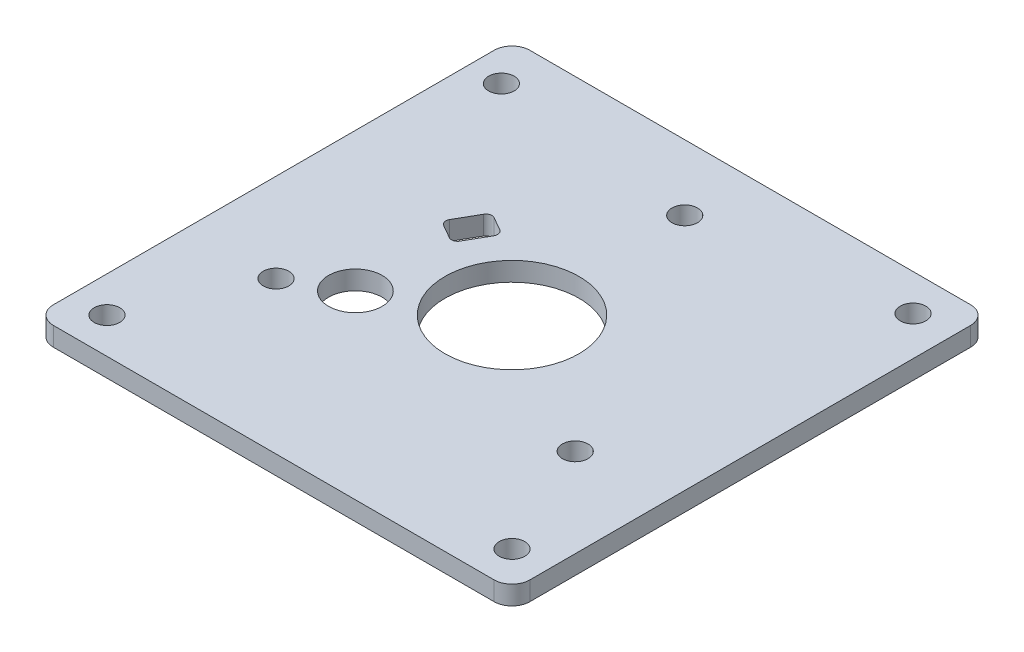
ISO-10303-21;
HEADER;
FILE_DESCRIPTION(('STEP AP214'),'2;1');
FILE_NAME('part.step','',(''),(''),'','','');
FILE_SCHEMA(('AUTOMOTIVE_DESIGN { 1 0 10303 214 1 1 1 1 }'));
ENDSEC;
DATA;
#1=APPLICATION_CONTEXT('core data for automotive mechanical design processes');
#2=APPLICATION_PROTOCOL_DEFINITION('international standard','automotive_design',2000,#1);
#3=PRODUCT_CONTEXT('',#1,'mechanical');
#4=PRODUCT('Part','Part','',(#3));
#5=PRODUCT_RELATED_PRODUCT_CATEGORY('part','',(#4));
#6=PRODUCT_DEFINITION_FORMATION('','',#4);
#7=PRODUCT_DEFINITION_CONTEXT('part definition',#1,'design');
#8=PRODUCT_DEFINITION('design','',#6,#7);
#9=PRODUCT_DEFINITION_SHAPE('','',#8);
#10=(LENGTH_UNIT() NAMED_UNIT(*) SI_UNIT(.MILLI.,.METRE.));
#11=(NAMED_UNIT(*) PLANE_ANGLE_UNIT() SI_UNIT($,.RADIAN.));
#12=(NAMED_UNIT(*) SI_UNIT($,.STERADIAN.) SOLID_ANGLE_UNIT());
#13=UNCERTAINTY_MEASURE_WITH_UNIT(LENGTH_MEASURE(1.E-05),#10,'distance_accuracy_value','');
#14=(GEOMETRIC_REPRESENTATION_CONTEXT(3) GLOBAL_UNCERTAINTY_ASSIGNED_CONTEXT((#13)) GLOBAL_UNIT_ASSIGNED_CONTEXT((#10,
#11,#12)) REPRESENTATION_CONTEXT('',''));
#15=CARTESIAN_POINT('',(0.,0.,0.));
#16=DIRECTION('',(0.,0.,1.));
#17=DIRECTION('',(1.,0.,0.));
#18=AXIS2_PLACEMENT_3D('',#15,#16,#17);
#19=CARTESIAN_POINT('',(0.,3.175,0.));
#20=DIRECTION('',(0.,-1.,0.));
#21=DIRECTION('',(0.,0.,-1.));
#22=AXIS2_PLACEMENT_3D('',#19,#20,#21);
#23=PLANE('',#22);
#24=CARTESIAN_POINT('',(-16.6709890228504,3.175,9.625));
#25=DIRECTION('',(0.,1.,0.));
#26=DIRECTION('',(0.,0.,1.));
#27=AXIS2_PLACEMENT_3D('',#24,#25,#26);
#28=CIRCLE('',#27,4.5);
#29=CARTESIAN_POINT('',(-16.6709890228504,3.175,14.125));
#30=VERTEX_POINT('',#29);
#31=EDGE_CURVE('E313',#30,#30,#28,.T.);
#32=ORIENTED_EDGE('',*,*,#31,.F.);
#33=EDGE_LOOP('',(#32));
#34=FACE_BOUND('',#33,.T.);
#35=CARTESIAN_POINT('',(-34.552045292833,3.175,-32.7718254397796));
#36=DIRECTION('',(0.,1.,0.));
#37=DIRECTION('',(0.,0.,-1.));
#38=AXIS2_PLACEMENT_3D('',#35,#36,#37);
#39=CIRCLE('',#38,2.15);
#40=CARTESIAN_POINT('',(-34.552045292833,3.175,-34.9218254397796));
#41=VERTEX_POINT('',#40);
#42=EDGE_CURVE('E333',#41,#41,#39,.T.);
#43=ORIENTED_EDGE('',*,*,#42,.F.);
#44=EDGE_LOOP('',(#43));
#45=FACE_BOUND('',#44,.T.);
#46=CARTESIAN_POINT('',(33.4386592201806,3.175,-33.8961473794748));
#47=DIRECTION('',(0.,1.,0.));
#48=DIRECTION('',(0.,0.,1.));
#49=AXIS2_PLACEMENT_3D('',#46,#47,#48);
#50=CIRCLE('',#49,2.15000000000001);
#51=CARTESIAN_POINT('',(33.4386592201806,3.175,-31.7461473794748));
#52=VERTEX_POINT('',#51);
#53=EDGE_CURVE('E341',#52,#52,#50,.T.);
#54=ORIENTED_EDGE('',*,*,#53,.F.);
#55=EDGE_LOOP('',(#54));
#56=FACE_BOUND('',#55,.T.);
#57=CARTESIAN_POINT('',(34.,3.175,34.));
#58=DIRECTION('',(0.,1.,0.));
#59=DIRECTION('',(0.,0.,-1.));
#60=AXIS2_PLACEMENT_3D('',#57,#58,#59);
#61=CIRCLE('',#60,2.15);
#62=CARTESIAN_POINT('',(34.,3.175,31.85));
#63=VERTEX_POINT('',#62);
#64=EDGE_CURVE('E349',#63,#63,#61,.T.);
#65=ORIENTED_EDGE('',*,*,#64,.F.);
#66=EDGE_LOOP('',(#65));
#67=FACE_BOUND('',#66,.T.);
#68=CARTESIAN_POINT('',(-25.1147367097478,3.175,14.4999999999995));
#69=DIRECTION('',(0.,1.,0.));
#70=DIRECTION('',(0.,0.,1.));
#71=AXIS2_PLACEMENT_3D('',#68,#69,#70);
#72=CIRCLE('',#71,2.15000000000057);
#73=CARTESIAN_POINT('',(-25.1147367097478,3.175,16.65));
#74=VERTEX_POINT('',#73);
#75=EDGE_CURVE('E357',#74,#74,#72,.T.);
#76=ORIENTED_EDGE('',*,*,#75,.F.);
#77=EDGE_LOOP('',(#76));
#78=FACE_BOUND('',#77,.T.);
#79=CARTESIAN_POINT('',(25.1147367097487,3.175,14.4999999999989));
#80=DIRECTION('',(0.,1.,0.));
#81=DIRECTION('',(0.,0.,1.));
#82=AXIS2_PLACEMENT_3D('',#79,#80,#81);
#83=CIRCLE('',#82,2.15000000000118);
#84=CARTESIAN_POINT('',(25.1147367097487,3.175,16.6500000000001));
#85=VERTEX_POINT('',#84);
#86=EDGE_CURVE('E365',#85,#85,#83,.T.);
#87=ORIENTED_EDGE('',*,*,#86,.F.);
#88=EDGE_LOOP('',(#87));
#89=FACE_BOUND('',#88,.T.);
#90=CARTESIAN_POINT('',(-34.,3.175,34.));
#91=DIRECTION('',(0.,1.,0.));
#92=DIRECTION('',(0.,0.,1.));
#93=AXIS2_PLACEMENT_3D('',#90,#91,#92);
#94=CIRCLE('',#93,2.15);
#95=CARTESIAN_POINT('',(-34.,3.175,36.15));
#96=VERTEX_POINT('',#95);
#97=EDGE_CURVE('E373',#96,#96,#94,.T.);
#98=ORIENTED_EDGE('',*,*,#97,.F.);
#99=EDGE_LOOP('',(#98));
#100=FACE_BOUND('',#99,.T.);
#101=CARTESIAN_POINT('',(0.,3.175,-29.));
#102=DIRECTION('',(0.,1.,0.));
#103=DIRECTION('',(0.,0.,1.));
#104=AXIS2_PLACEMENT_3D('',#101,#102,#103);
#105=CIRCLE('',#104,2.15);
#106=CARTESIAN_POINT('',(0.,3.175,-26.85));
#107=VERTEX_POINT('',#106);
#108=EDGE_CURVE('E381',#107,#107,#105,.T.);
#109=ORIENTED_EDGE('',*,*,#108,.F.);
#110=EDGE_LOOP('',(#109));
#111=FACE_BOUND('',#110,.T.);
#112=CARTESIAN_POINT('',(0.,3.175,0.));
#113=DIRECTION('',(0.,1.,0.));
#114=DIRECTION('',(0.,0.,1.));
#115=AXIS2_PLACEMENT_3D('',#112,#113,#114);
#116=CIRCLE('',#115,11.25);
#117=CARTESIAN_POINT('',(0.,3.175,11.25));
#118=VERTEX_POINT('',#117);
#119=EDGE_CURVE('E389',#118,#118,#116,.T.);
#120=ORIENTED_EDGE('',*,*,#119,.F.);
#121=EDGE_LOOP('',(#120));
#122=FACE_BOUND('',#121,.T.);
#123=DIRECTION('',(0.,0.,1.));
#124=VECTOR('',#123,1.);
#125=CARTESIAN_POINT('',(-40.,3.175,40.));
#126=LINE('',#125,#124);
#127=CARTESIAN_POINT('',(-40.,3.175,-37.));
#128=VERTEX_POINT('',#127);
#129=CARTESIAN_POINT('',(-40.,3.175,37.));
#130=VERTEX_POINT('',#129);
#131=EDGE_CURVE('E400',#128,#130,#126,.T.);
#132=ORIENTED_EDGE('',*,*,#131,.T.);
#133=CARTESIAN_POINT('',(-37.,3.175,37.));
#134=DIRECTION('',(0.,-1.,0.));
#135=DIRECTION('',(0.,0.,-1.));
#136=AXIS2_PLACEMENT_3D('',#133,#134,#135);
#137=CIRCLE('',#136,3.);
#138=CARTESIAN_POINT('',(-37.,3.175,40.));
#139=VERTEX_POINT('',#138);
#140=EDGE_CURVE('E224',#130,#139,#137,.F.);
#141=ORIENTED_EDGE('',*,*,#140,.T.);
#142=DIRECTION('',(1.,0.,0.));
#143=VECTOR('',#142,1.);
#144=CARTESIAN_POINT('',(-40.,3.175,40.));
#145=LINE('',#144,#143);
#146=CARTESIAN_POINT('',(37.,3.175,40.));
#147=VERTEX_POINT('',#146);
#148=EDGE_CURVE('E180',#139,#147,#145,.T.);
#149=ORIENTED_EDGE('',*,*,#148,.T.);
#150=CARTESIAN_POINT('',(37.,3.175,37.));
#151=DIRECTION('',(0.,-1.,0.));
#152=DIRECTION('',(0.,0.,-1.));
#153=AXIS2_PLACEMENT_3D('',#150,#151,#152);
#154=CIRCLE('',#153,3.);
#155=CARTESIAN_POINT('',(40.,3.175,37.));
#156=VERTEX_POINT('',#155);
#157=EDGE_CURVE('E221',#147,#156,#154,.F.);
#158=ORIENTED_EDGE('',*,*,#157,.T.);
#159=DIRECTION('',(0.,0.,-1.));
#160=VECTOR('',#159,1.);
#161=CARTESIAN_POINT('',(40.,3.175,40.));
#162=LINE('',#161,#160);
#163=CARTESIAN_POINT('',(40.,3.175,-37.));
#164=VERTEX_POINT('',#163);
#165=EDGE_CURVE('E189',#156,#164,#162,.T.);
#166=ORIENTED_EDGE('',*,*,#165,.T.);
#167=CARTESIAN_POINT('',(37.,3.175,-37.));
#168=DIRECTION('',(0.,-1.,0.));
#169=DIRECTION('',(0.,0.,-1.));
#170=AXIS2_PLACEMENT_3D('',#167,#168,#169);
#171=CIRCLE('',#170,3.);
#172=CARTESIAN_POINT('',(37.,3.175,-40.));
#173=VERTEX_POINT('',#172);
#174=EDGE_CURVE('E218',#164,#173,#171,.F.);
#175=ORIENTED_EDGE('',*,*,#174,.T.);
#176=DIRECTION('',(-1.,0.,0.));
#177=VECTOR('',#176,1.);
#178=CARTESIAN_POINT('',(-40.,3.175,-40.));
#179=LINE('',#178,#177);
#180=CARTESIAN_POINT('',(-37.,3.175,-40.));
#181=VERTEX_POINT('',#180);
#182=EDGE_CURVE('E195',#173,#181,#179,.T.);
#183=ORIENTED_EDGE('',*,*,#182,.T.);
#184=CARTESIAN_POINT('',(-37.,3.175,-37.));
#185=DIRECTION('',(0.,-1.,0.));
#186=DIRECTION('',(0.,0.,-1.));
#187=AXIS2_PLACEMENT_3D('',#184,#185,#186);
#188=CIRCLE('',#187,3.);
#189=EDGE_CURVE('E215',#181,#128,#188,.F.);
#190=ORIENTED_EDGE('',*,*,#189,.T.);
#191=EDGE_LOOP('',(#132,#141,#149,#158,#166,#175,#183,#190));
#192=FACE_BOUND('',#191,.T.);
#193=DIRECTION('',(-0.497198669268816,0.,0.867636723103234));
#194=VECTOR('',#193,1.);
#195=CARTESIAN_POINT('',(-16.5436071877628,3.175,-13.1611878160145));
#196=LINE('',#195,#194);
#197=CARTESIAN_POINT('',(-17.0408058570316,3.175,-12.2935510929113));
#198=VERTEX_POINT('',#197);
#199=CARTESIAN_POINT('',(-19.1290402679607,3.175,-8.64947685587768));
#200=VERTEX_POINT('',#199);
#201=EDGE_CURVE('E328',#198,#200,#196,.T.);
#202=ORIENTED_EDGE('',*,*,#201,.F.);
#203=CARTESIAN_POINT('',(-16.1731691339284,3.175,-11.7963524236425));
#204=DIRECTION('',(0.,-1.,0.));
#205=DIRECTION('',(0.,0.,-1.));
#206=AXIS2_PLACEMENT_3D('',#203,#204,#205);
#207=CIRCLE('',#206,1.);
#208=CARTESIAN_POINT('',(-15.6759704646596,3.175,-12.6639891467457));
#209=VERTEX_POINT('',#208);
#210=EDGE_CURVE('E11',#198,#209,#207,.T.);
#211=ORIENTED_EDGE('',*,*,#210,.T.);
#212=DIRECTION('',(-0.867636723103236,0.,-0.497198669268813));
#213=VECTOR('',#212,1.);
#214=CARTESIAN_POINT('',(-12.5524782614879,3.175,-10.874073937378));
#215=LINE('',#214,#213);
#216=CARTESIAN_POINT('',(-13.4201149845912,3.175,-11.3712726066468));
#217=VERTEX_POINT('',#216);
#218=EDGE_CURVE('E304',#217,#209,#215,.T.);
#219=ORIENTED_EDGE('',*,*,#218,.F.);
#220=CARTESIAN_POINT('',(-13.91731365386,3.175,-10.5036358835435));
#221=DIRECTION('',(0.,-1.,0.));
#222=DIRECTION('',(0.,0.,-1.));
#223=AXIS2_PLACEMENT_3D('',#220,#221,#222);
#224=CIRCLE('',#223,1.);
#225=CARTESIAN_POINT('',(-13.0496769307568,3.175,-10.0064372142747));
#226=VERTEX_POINT('',#225);
#227=EDGE_CURVE('E283',#217,#226,#224,.T.);
#228=ORIENTED_EDGE('',*,*,#227,.T.);
#229=DIRECTION('',(0.497198669268815,0.,-0.867636723103235));
#230=VECTOR('',#229,1.);
#231=CARTESIAN_POINT('',(-15.6351100109546,3.175,-5.49472625413789));
#232=LINE('',#231,#230);
#233=CARTESIAN_POINT('',(-15.1379113416858,3.175,-6.36236297724113));
#234=VERTEX_POINT('',#233);
#235=EDGE_CURVE('E308',#234,#226,#232,.T.);
#236=ORIENTED_EDGE('',*,*,#235,.F.);
#237=CARTESIAN_POINT('',(-16.005548064789,3.175,-6.85956164650995));
#238=DIRECTION('',(0.,-1.,0.));
#239=DIRECTION('',(0.,0.,-1.));
#240=AXIS2_PLACEMENT_3D('',#237,#238,#239);
#241=CIRCLE('',#240,1.);
#242=CARTESIAN_POINT('',(-16.5027467340578,3.175,-5.99192492340671));
#243=VERTEX_POINT('',#242);
#244=EDGE_CURVE('E277',#234,#243,#241,.T.);
#245=ORIENTED_EDGE('',*,*,#244,.T.);
#246=DIRECTION('',(0.867636723103234,0.,0.497198669268816));
#247=VECTOR('',#246,1.);
#248=CARTESIAN_POINT('',(-19.6262389372295,3.175,-7.78184013277445));
#249=LINE('',#248,#247);
#250=CARTESIAN_POINT('',(-18.7586022141262,3.175,-7.28464146350563));
#251=VERTEX_POINT('',#250);
#252=EDGE_CURVE('E316',#251,#243,#249,.T.);
#253=ORIENTED_EDGE('',*,*,#252,.F.);
#254=CARTESIAN_POINT('',(-18.2614035448574,3.175,-8.15227818660887));
#255=DIRECTION('',(0.,-1.,0.));
#256=DIRECTION('',(0.,0.,-1.));
#257=AXIS2_PLACEMENT_3D('',#254,#255,#256);
#258=CIRCLE('',#257,1.);
#259=EDGE_CURVE('E271',#251,#200,#258,.T.);
#260=ORIENTED_EDGE('',*,*,#259,.T.);
#261=EDGE_LOOP('',(#202,#211,#219,#228,#236,#245,#253,#260));
#262=FACE_BOUND('',#261,.T.);
#263=ADVANCED_FACE('F45',(#34,#45,#56,#67,#78,#89,#100,#111,#122,#192,#262),#23,.F.);
#264=CARTESIAN_POINT('',(0.,0.,0.));
#265=DIRECTION('',(0.,-1.,0.));
#266=DIRECTION('',(0.,0.,-1.));
#267=AXIS2_PLACEMENT_3D('',#264,#265,#266);
#268=PLANE('',#267);
#269=CARTESIAN_POINT('',(-34.552045292833,0.,-32.7718254397796));
#270=DIRECTION('',(0.,1.,0.));
#271=DIRECTION('',(0.,0.,-1.));
#272=AXIS2_PLACEMENT_3D('',#269,#270,#271);
#273=CIRCLE('',#272,2.15);
#274=CARTESIAN_POINT('',(-34.552045292833,0.,-34.9218254397796));
#275=VERTEX_POINT('',#274);
#276=EDGE_CURVE('E331',#275,#275,#273,.T.);
#277=ORIENTED_EDGE('',*,*,#276,.T.);
#278=EDGE_LOOP('',(#277));
#279=FACE_BOUND('',#278,.T.);
#280=CARTESIAN_POINT('',(34.,0.,34.));
#281=DIRECTION('',(0.,1.,0.));
#282=DIRECTION('',(0.,0.,-1.));
#283=AXIS2_PLACEMENT_3D('',#280,#281,#282);
#284=CIRCLE('',#283,2.15);
#285=CARTESIAN_POINT('',(34.,0.,31.85));
#286=VERTEX_POINT('',#285);
#287=EDGE_CURVE('E345',#286,#286,#284,.T.);
#288=ORIENTED_EDGE('',*,*,#287,.T.);
#289=EDGE_LOOP('',(#288));
#290=FACE_BOUND('',#289,.T.);
#291=CARTESIAN_POINT('',(25.1147367097487,0.,14.4999999999989));
#292=DIRECTION('',(0.,1.,0.));
#293=DIRECTION('',(0.,0.,1.));
#294=AXIS2_PLACEMENT_3D('',#291,#292,#293);
#295=CIRCLE('',#294,2.15000000000118);
#296=CARTESIAN_POINT('',(25.1147367097487,0.,16.6500000000001));
#297=VERTEX_POINT('',#296);
#298=EDGE_CURVE('E361',#297,#297,#295,.T.);
#299=ORIENTED_EDGE('',*,*,#298,.T.);
#300=EDGE_LOOP('',(#299));
#301=FACE_BOUND('',#300,.T.);
#302=CARTESIAN_POINT('',(0.,0.,-29.));
#303=DIRECTION('',(0.,1.,0.));
#304=DIRECTION('',(0.,0.,1.));
#305=AXIS2_PLACEMENT_3D('',#302,#303,#304);
#306=CIRCLE('',#305,2.15);
#307=CARTESIAN_POINT('',(0.,0.,-26.85));
#308=VERTEX_POINT('',#307);
#309=EDGE_CURVE('E377',#308,#308,#306,.T.);
#310=ORIENTED_EDGE('',*,*,#309,.T.);
#311=EDGE_LOOP('',(#310));
#312=FACE_BOUND('',#311,.T.);
#313=DIRECTION('',(1.,0.,0.));
#314=VECTOR('',#313,1.);
#315=CARTESIAN_POINT('',(-40.,0.,40.));
#316=LINE('',#315,#314);
#317=CARTESIAN_POINT('',(-37.,0.,40.));
#318=VERTEX_POINT('',#317);
#319=CARTESIAN_POINT('',(37.,0.,40.));
#320=VERTEX_POINT('',#319);
#321=EDGE_CURVE('E177',#318,#320,#316,.T.);
#322=ORIENTED_EDGE('',*,*,#321,.F.);
#323=CARTESIAN_POINT('',(-37.,0.,37.));
#324=DIRECTION('',(0.,-1.,0.));
#325=DIRECTION('',(0.,0.,-1.));
#326=AXIS2_PLACEMENT_3D('',#323,#324,#325);
#327=CIRCLE('',#326,3.);
#328=CARTESIAN_POINT('',(-40.,0.,37.));
#329=VERTEX_POINT('',#328);
#330=EDGE_CURVE('E159',#318,#329,#327,.T.);
#331=ORIENTED_EDGE('',*,*,#330,.T.);
#332=DIRECTION('',(0.,0.,1.));
#333=VECTOR('',#332,1.);
#334=CARTESIAN_POINT('',(-40.,0.,40.));
#335=LINE('',#334,#333);
#336=CARTESIAN_POINT('',(-40.,0.,-37.));
#337=VERTEX_POINT('',#336);
#338=EDGE_CURVE('E190',#337,#329,#335,.T.);
#339=ORIENTED_EDGE('',*,*,#338,.F.);
#340=CARTESIAN_POINT('',(-37.,0.,-37.));
#341=DIRECTION('',(0.,-1.,0.));
#342=DIRECTION('',(0.,0.,-1.));
#343=AXIS2_PLACEMENT_3D('',#340,#341,#342);
#344=CIRCLE('',#343,3.);
#345=CARTESIAN_POINT('',(-37.,0.,-40.));
#346=VERTEX_POINT('',#345);
#347=EDGE_CURVE('E182',#337,#346,#344,.T.);
#348=ORIENTED_EDGE('',*,*,#347,.T.);
#349=DIRECTION('',(-1.,0.,0.));
#350=VECTOR('',#349,1.);
#351=CARTESIAN_POINT('',(-40.,0.,-40.));
#352=LINE('',#351,#350);
#353=CARTESIAN_POINT('',(37.,0.,-40.));
#354=VERTEX_POINT('',#353);
#355=EDGE_CURVE('E197',#354,#346,#352,.T.);
#356=ORIENTED_EDGE('',*,*,#355,.F.);
#357=CARTESIAN_POINT('',(37.,0.,-37.));
#358=DIRECTION('',(0.,-1.,0.));
#359=DIRECTION('',(0.,0.,-1.));
#360=AXIS2_PLACEMENT_3D('',#357,#358,#359);
#361=CIRCLE('',#360,3.);
#362=CARTESIAN_POINT('',(40.,0.,-37.));
#363=VERTEX_POINT('',#362);
#364=EDGE_CURVE('E205',#354,#363,#361,.T.);
#365=ORIENTED_EDGE('',*,*,#364,.T.);
#366=DIRECTION('',(0.,0.,-1.));
#367=VECTOR('',#366,1.);
#368=CARTESIAN_POINT('',(40.,0.,40.));
#369=LINE('',#368,#367);
#370=CARTESIAN_POINT('',(40.,0.,37.));
#371=VERTEX_POINT('',#370);
#372=EDGE_CURVE('E393',#371,#363,#369,.T.);
#373=ORIENTED_EDGE('',*,*,#372,.F.);
#374=CARTESIAN_POINT('',(37.,0.,37.));
#375=DIRECTION('',(0.,-1.,0.));
#376=DIRECTION('',(0.,0.,-1.));
#377=AXIS2_PLACEMENT_3D('',#374,#375,#376);
#378=CIRCLE('',#377,3.);
#379=EDGE_CURVE('E171',#371,#320,#378,.T.);
#380=ORIENTED_EDGE('',*,*,#379,.T.);
#381=EDGE_LOOP('',(#322,#331,#339,#348,#356,#365,#373,#380));
#382=FACE_BOUND('',#381,.T.);
#383=CARTESIAN_POINT('',(0.,0.,0.));
#384=DIRECTION('',(0.,1.,0.));
#385=DIRECTION('',(0.,0.,1.));
#386=AXIS2_PLACEMENT_3D('',#383,#384,#385);
#387=CIRCLE('',#386,11.25);
#388=CARTESIAN_POINT('',(0.,0.,11.25));
#389=VERTEX_POINT('',#388);
#390=EDGE_CURVE('E385',#389,#389,#387,.T.);
#391=ORIENTED_EDGE('',*,*,#390,.T.);
#392=EDGE_LOOP('',(#391));
#393=FACE_BOUND('',#392,.T.);
#394=CARTESIAN_POINT('',(-34.,0.,34.));
#395=DIRECTION('',(0.,1.,0.));
#396=DIRECTION('',(0.,0.,1.));
#397=AXIS2_PLACEMENT_3D('',#394,#395,#396);
#398=CIRCLE('',#397,2.15);
#399=CARTESIAN_POINT('',(-34.,0.,36.15));
#400=VERTEX_POINT('',#399);
#401=EDGE_CURVE('E369',#400,#400,#398,.T.);
#402=ORIENTED_EDGE('',*,*,#401,.T.);
#403=EDGE_LOOP('',(#402));
#404=FACE_BOUND('',#403,.T.);
#405=CARTESIAN_POINT('',(-25.1147367097478,0.,14.4999999999995));
#406=DIRECTION('',(0.,1.,0.));
#407=DIRECTION('',(0.,0.,1.));
#408=AXIS2_PLACEMENT_3D('',#405,#406,#407);
#409=CIRCLE('',#408,2.15000000000057);
#410=CARTESIAN_POINT('',(-25.1147367097478,0.,16.65));
#411=VERTEX_POINT('',#410);
#412=EDGE_CURVE('E353',#411,#411,#409,.T.);
#413=ORIENTED_EDGE('',*,*,#412,.T.);
#414=EDGE_LOOP('',(#413));
#415=FACE_BOUND('',#414,.T.);
#416=CARTESIAN_POINT('',(33.4386592201806,0.,-33.8961473794748));
#417=DIRECTION('',(0.,1.,0.));
#418=DIRECTION('',(0.,0.,1.));
#419=AXIS2_PLACEMENT_3D('',#416,#417,#418);
#420=CIRCLE('',#419,2.15000000000001);
#421=CARTESIAN_POINT('',(33.4386592201806,0.,-31.7461473794748));
#422=VERTEX_POINT('',#421);
#423=EDGE_CURVE('E337',#422,#422,#420,.T.);
#424=ORIENTED_EDGE('',*,*,#423,.T.);
#425=EDGE_LOOP('',(#424));
#426=FACE_BOUND('',#425,.T.);
#427=CARTESIAN_POINT('',(-16.6709890228504,0.,9.625));
#428=DIRECTION('',(0.,1.,0.));
#429=DIRECTION('',(0.,0.,1.));
#430=AXIS2_PLACEMENT_3D('',#427,#428,#429);
#431=CIRCLE('',#430,4.5);
#432=CARTESIAN_POINT('',(-16.6709890228504,0.,14.125));
#433=VERTEX_POINT('',#432);
#434=EDGE_CURVE('E307',#433,#433,#431,.T.);
#435=ORIENTED_EDGE('',*,*,#434,.T.);
#436=EDGE_LOOP('',(#435));
#437=FACE_BOUND('',#436,.T.);
#438=DIRECTION('',(0.497198669268815,0.,-0.867636723103235));
#439=VECTOR('',#438,1.);
#440=CARTESIAN_POINT('',(-15.6351100109546,0.,-5.49472625413789));
#441=LINE('',#440,#439);
#442=CARTESIAN_POINT('',(-15.1379113416858,0.,-6.36236297724113));
#443=VERTEX_POINT('',#442);
#444=CARTESIAN_POINT('',(-13.0496769307568,0.,-10.0064372142747));
#445=VERTEX_POINT('',#444);
#446=EDGE_CURVE('E323',#443,#445,#441,.T.);
#447=ORIENTED_EDGE('',*,*,#446,.T.);
#448=CARTESIAN_POINT('',(-13.91731365386,0.,-10.5036358835435));
#449=DIRECTION('',(0.,-1.,0.));
#450=DIRECTION('',(0.,0.,-1.));
#451=AXIS2_PLACEMENT_3D('',#448,#449,#450);
#452=CIRCLE('',#451,1.);
#453=CARTESIAN_POINT('',(-13.4201149845912,0.,-11.3712726066468));
#454=VERTEX_POINT('',#453);
#455=EDGE_CURVE('E280',#445,#454,#452,.F.);
#456=ORIENTED_EDGE('',*,*,#455,.T.);
#457=DIRECTION('',(-0.867636723103236,0.,-0.497198669268813));
#458=VECTOR('',#457,1.);
#459=CARTESIAN_POINT('',(-12.5524782614879,0.,-10.874073937378));
#460=LINE('',#459,#458);
#461=CARTESIAN_POINT('',(-15.6759704646596,0.,-12.6639891467457));
#462=VERTEX_POINT('',#461);
#463=EDGE_CURVE('E292',#454,#462,#460,.T.);
#464=ORIENTED_EDGE('',*,*,#463,.T.);
#465=CARTESIAN_POINT('',(-16.1731691339284,0.,-11.7963524236425));
#466=DIRECTION('',(0.,-1.,0.));
#467=DIRECTION('',(0.,0.,-1.));
#468=AXIS2_PLACEMENT_3D('',#465,#466,#467);
#469=CIRCLE('',#468,1.);
#470=CARTESIAN_POINT('',(-17.0408058570316,0.,-12.2935510929113));
#471=VERTEX_POINT('',#470);
#472=EDGE_CURVE('E54',#462,#471,#469,.F.);
#473=ORIENTED_EDGE('',*,*,#472,.T.);
#474=DIRECTION('',(-0.497198669268816,0.,0.867636723103234));
#475=VECTOR('',#474,1.);
#476=CARTESIAN_POINT('',(-16.5436071877628,0.,-13.1611878160145));
#477=LINE('',#476,#475);
#478=CARTESIAN_POINT('',(-19.1290402679607,0.,-8.64947685587768));
#479=VERTEX_POINT('',#478);
#480=EDGE_CURVE('E291',#471,#479,#477,.T.);
#481=ORIENTED_EDGE('',*,*,#480,.T.);
#482=CARTESIAN_POINT('',(-18.2614035448574,0.,-8.15227818660887));
#483=DIRECTION('',(0.,-1.,0.));
#484=DIRECTION('',(0.,0.,-1.));
#485=AXIS2_PLACEMENT_3D('',#482,#483,#484);
#486=CIRCLE('',#485,1.);
#487=CARTESIAN_POINT('',(-18.7586022141262,0.,-7.28464146350563));
#488=VERTEX_POINT('',#487);
#489=EDGE_CURVE('E268',#479,#488,#486,.F.);
#490=ORIENTED_EDGE('',*,*,#489,.T.);
#491=DIRECTION('',(0.867636723103234,0.,0.497198669268816));
#492=VECTOR('',#491,1.);
#493=CARTESIAN_POINT('',(-19.6262389372295,0.,-7.78184013277445));
#494=LINE('',#493,#492);
#495=CARTESIAN_POINT('',(-16.5027467340578,0.,-5.99192492340671));
#496=VERTEX_POINT('',#495);
#497=EDGE_CURVE('E301',#488,#496,#494,.T.);
#498=ORIENTED_EDGE('',*,*,#497,.T.);
#499=CARTESIAN_POINT('',(-16.005548064789,0.,-6.85956164650995));
#500=DIRECTION('',(0.,-1.,0.));
#501=DIRECTION('',(0.,0.,-1.));
#502=AXIS2_PLACEMENT_3D('',#499,#500,#501);
#503=CIRCLE('',#502,1.);
#504=EDGE_CURVE('E274',#496,#443,#503,.F.);
#505=ORIENTED_EDGE('',*,*,#504,.T.);
#506=EDGE_LOOP('',(#447,#456,#464,#473,#481,#490,#498,#505));
#507=FACE_BOUND('',#506,.T.);
#508=ADVANCED_FACE('F185',(#279,#290,#301,#312,#382,#393,#404,#415,#426,#437,#507),#268,.T.);
#509=CARTESIAN_POINT('',(40.,3.175,40.));
#510=DIRECTION('',(-1.,0.,0.));
#511=DIRECTION('',(0.,0.,1.));
#512=AXIS2_PLACEMENT_3D('',#509,#510,#511);
#513=PLANE('',#512);
#514=ORIENTED_EDGE('',*,*,#165,.F.);
#515=DIRECTION('',(0.,-1.,0.));
#516=VECTOR('',#515,1.);
#517=CARTESIAN_POINT('',(40.,3.175,37.));
#518=LINE('',#517,#516);
#519=EDGE_CURVE('E230',#156,#371,#518,.T.);
#520=ORIENTED_EDGE('',*,*,#519,.T.);
#521=ORIENTED_EDGE('',*,*,#372,.T.);
#522=DIRECTION('',(0.,-1.,0.));
#523=VECTOR('',#522,1.);
#524=CARTESIAN_POINT('',(40.,3.175,-37.));
#525=LINE('',#524,#523);
#526=EDGE_CURVE('E227',#363,#164,#525,.F.);
#527=ORIENTED_EDGE('',*,*,#526,.T.);
#528=EDGE_LOOP('',(#514,#520,#521,#527));
#529=FACE_BOUND('',#528,.T.);
#530=ADVANCED_FACE('F432',(#529),#513,.F.);
#531=CARTESIAN_POINT('',(-40.,3.175,-40.));
#532=DIRECTION('',(0.,0.,1.));
#533=DIRECTION('',(1.,0.,0.));
#534=AXIS2_PLACEMENT_3D('',#531,#532,#533);
#535=PLANE('',#534);
#536=ORIENTED_EDGE('',*,*,#182,.F.);
#537=DIRECTION('',(0.,-1.,0.));
#538=VECTOR('',#537,1.);
#539=CARTESIAN_POINT('',(37.,3.175,-40.));
#540=LINE('',#539,#538);
#541=EDGE_CURVE('E237',#173,#354,#540,.T.);
#542=ORIENTED_EDGE('',*,*,#541,.T.);
#543=ORIENTED_EDGE('',*,*,#355,.T.);
#544=DIRECTION('',(0.,-1.,0.));
#545=VECTOR('',#544,1.);
#546=CARTESIAN_POINT('',(-37.,3.175,-40.));
#547=LINE('',#546,#545);
#548=EDGE_CURVE('E234',#346,#181,#547,.F.);
#549=ORIENTED_EDGE('',*,*,#548,.T.);
#550=EDGE_LOOP('',(#536,#542,#543,#549));
#551=FACE_BOUND('',#550,.T.);
#552=ADVANCED_FACE('F414',(#551),#535,.F.);
#553=CARTESIAN_POINT('',(-40.,3.175,40.));
#554=DIRECTION('',(1.,0.,0.));
#555=DIRECTION('',(0.,0.,-1.));
#556=AXIS2_PLACEMENT_3D('',#553,#554,#555);
#557=PLANE('',#556);
#558=ORIENTED_EDGE('',*,*,#338,.T.);
#559=DIRECTION('',(0.,-1.,0.));
#560=VECTOR('',#559,1.);
#561=CARTESIAN_POINT('',(-40.,3.175,37.));
#562=LINE('',#561,#560);
#563=EDGE_CURVE('E164',#329,#130,#562,.F.);
#564=ORIENTED_EDGE('',*,*,#563,.T.);
#565=ORIENTED_EDGE('',*,*,#131,.F.);
#566=DIRECTION('',(0.,-1.,0.));
#567=VECTOR('',#566,1.);
#568=CARTESIAN_POINT('',(-40.,3.175,-37.));
#569=LINE('',#568,#567);
#570=EDGE_CURVE('E170',#128,#337,#569,.T.);
#571=ORIENTED_EDGE('',*,*,#570,.T.);
#572=EDGE_LOOP('',(#558,#564,#565,#571));
#573=FACE_BOUND('',#572,.T.);
#574=ADVANCED_FACE('F423',(#573),#557,.F.);
#575=CARTESIAN_POINT('',(-40.,3.175,40.));
#576=DIRECTION('',(0.,0.,-1.));
#577=DIRECTION('',(-1.,0.,0.));
#578=AXIS2_PLACEMENT_3D('',#575,#576,#577);
#579=PLANE('',#578);
#580=ORIENTED_EDGE('',*,*,#148,.F.);
#581=DIRECTION('',(0.,-1.,0.));
#582=VECTOR('',#581,1.);
#583=CARTESIAN_POINT('',(-37.,3.175,40.));
#584=LINE('',#583,#582);
#585=EDGE_CURVE('E163',#139,#318,#584,.T.);
#586=ORIENTED_EDGE('',*,*,#585,.T.);
#587=ORIENTED_EDGE('',*,*,#321,.T.);
#588=DIRECTION('',(0.,-1.,0.));
#589=VECTOR('',#588,1.);
#590=CARTESIAN_POINT('',(37.,3.175,40.));
#591=LINE('',#590,#589);
#592=EDGE_CURVE('E183',#320,#147,#591,.F.);
#593=ORIENTED_EDGE('',*,*,#592,.T.);
#594=EDGE_LOOP('',(#580,#586,#587,#593));
#595=FACE_BOUND('',#594,.T.);
#596=ADVANCED_FACE('F176',(#595),#579,.F.);
#597=CARTESIAN_POINT('',(0.,3.175,0.));
#598=DIRECTION('',(0.,-1.,0.));
#599=DIRECTION('',(0.,0.,-1.));
#600=AXIS2_PLACEMENT_3D('',#597,#598,#599);
#601=CYLINDRICAL_SURFACE('',#600,11.25);
#602=ORIENTED_EDGE('',*,*,#119,.T.);
#603=EDGE_LOOP('',(#602));
#604=FACE_BOUND('',#603,.T.);
#605=ORIENTED_EDGE('',*,*,#390,.F.);
#606=EDGE_LOOP('',(#605));
#607=FACE_BOUND('',#606,.T.);
#608=ADVANCED_FACE('F430',(#604,#607),#601,.F.);
#609=CARTESIAN_POINT('',(0.,3.175,-29.));
#610=DIRECTION('',(0.,-1.,0.));
#611=DIRECTION('',(0.,0.,-1.));
#612=AXIS2_PLACEMENT_3D('',#609,#610,#611);
#613=CYLINDRICAL_SURFACE('',#612,2.15);
#614=ORIENTED_EDGE('',*,*,#108,.T.);
#615=EDGE_LOOP('',(#614));
#616=FACE_BOUND('',#615,.T.);
#617=ORIENTED_EDGE('',*,*,#309,.F.);
#618=EDGE_LOOP('',(#617));
#619=FACE_BOUND('',#618,.T.);
#620=ADVANCED_FACE('F448',(#616,#619),#613,.F.);
#621=CARTESIAN_POINT('',(-34.,3.175,34.));
#622=DIRECTION('',(0.,-1.,0.));
#623=DIRECTION('',(0.,0.,-1.));
#624=AXIS2_PLACEMENT_3D('',#621,#622,#623);
#625=CYLINDRICAL_SURFACE('',#624,2.15);
#626=ORIENTED_EDGE('',*,*,#97,.T.);
#627=EDGE_LOOP('',(#626));
#628=FACE_BOUND('',#627,.T.);
#629=ORIENTED_EDGE('',*,*,#401,.F.);
#630=EDGE_LOOP('',(#629));
#631=FACE_BOUND('',#630,.T.);
#632=ADVANCED_FACE('F452',(#628,#631),#625,.F.);
#633=CARTESIAN_POINT('',(25.1147367097487,3.175,14.4999999999989));
#634=DIRECTION('',(0.,-1.,0.));
#635=DIRECTION('',(0.,0.,-1.));
#636=AXIS2_PLACEMENT_3D('',#633,#634,#635);
#637=CYLINDRICAL_SURFACE('',#636,2.15000000000118);
#638=ORIENTED_EDGE('',*,*,#86,.T.);
#639=EDGE_LOOP('',(#638));
#640=FACE_BOUND('',#639,.T.);
#641=ORIENTED_EDGE('',*,*,#298,.F.);
#642=EDGE_LOOP('',(#641));
#643=FACE_BOUND('',#642,.T.);
#644=ADVANCED_FACE('F456',(#640,#643),#637,.F.);
#645=CARTESIAN_POINT('',(-25.1147367097478,3.175,14.4999999999995));
#646=DIRECTION('',(0.,-1.,0.));
#647=DIRECTION('',(0.,0.,-1.));
#648=AXIS2_PLACEMENT_3D('',#645,#646,#647);
#649=CYLINDRICAL_SURFACE('',#648,2.15000000000057);
#650=ORIENTED_EDGE('',*,*,#75,.T.);
#651=EDGE_LOOP('',(#650));
#652=FACE_BOUND('',#651,.T.);
#653=ORIENTED_EDGE('',*,*,#412,.F.);
#654=EDGE_LOOP('',(#653));
#655=FACE_BOUND('',#654,.T.);
#656=ADVANCED_FACE('F460',(#652,#655),#649,.F.);
#657=CARTESIAN_POINT('',(34.,3.175,34.));
#658=DIRECTION('',(0.,-1.,0.));
#659=DIRECTION('',(0.,0.,-1.));
#660=AXIS2_PLACEMENT_3D('',#657,#658,#659);
#661=CYLINDRICAL_SURFACE('',#660,2.15);
#662=ORIENTED_EDGE('',*,*,#64,.T.);
#663=EDGE_LOOP('',(#662));
#664=FACE_BOUND('',#663,.T.);
#665=ORIENTED_EDGE('',*,*,#287,.F.);
#666=EDGE_LOOP('',(#665));
#667=FACE_BOUND('',#666,.T.);
#668=ADVANCED_FACE('F464',(#664,#667),#661,.F.);
#669=CARTESIAN_POINT('',(33.4386592201806,3.175,-33.8961473794748));
#670=DIRECTION('',(0.,-1.,0.));
#671=DIRECTION('',(0.,0.,-1.));
#672=AXIS2_PLACEMENT_3D('',#669,#670,#671);
#673=CYLINDRICAL_SURFACE('',#672,2.15000000000001);
#674=ORIENTED_EDGE('',*,*,#53,.T.);
#675=EDGE_LOOP('',(#674));
#676=FACE_BOUND('',#675,.T.);
#677=ORIENTED_EDGE('',*,*,#423,.F.);
#678=EDGE_LOOP('',(#677));
#679=FACE_BOUND('',#678,.T.);
#680=ADVANCED_FACE('F468',(#676,#679),#673,.F.);
#681=CARTESIAN_POINT('',(-34.552045292833,3.175,-32.7718254397796));
#682=DIRECTION('',(0.,-1.,0.));
#683=DIRECTION('',(0.,0.,-1.));
#684=AXIS2_PLACEMENT_3D('',#681,#682,#683);
#685=CYLINDRICAL_SURFACE('',#684,2.15);
#686=ORIENTED_EDGE('',*,*,#42,.T.);
#687=EDGE_LOOP('',(#686));
#688=FACE_BOUND('',#687,.T.);
#689=ORIENTED_EDGE('',*,*,#276,.F.);
#690=EDGE_LOOP('',(#689));
#691=FACE_BOUND('',#690,.T.);
#692=ADVANCED_FACE('F472',(#688,#691),#685,.F.);
#693=CARTESIAN_POINT('',(-16.6709890228504,3.175,9.625));
#694=DIRECTION('',(0.,-1.,0.));
#695=DIRECTION('',(0.,0.,-1.));
#696=AXIS2_PLACEMENT_3D('',#693,#694,#695);
#697=CYLINDRICAL_SURFACE('',#696,4.5);
#698=ORIENTED_EDGE('',*,*,#31,.T.);
#699=EDGE_LOOP('',(#698));
#700=FACE_BOUND('',#699,.T.);
#701=ORIENTED_EDGE('',*,*,#434,.F.);
#702=EDGE_LOOP('',(#701));
#703=FACE_BOUND('',#702,.T.);
#704=ADVANCED_FACE('F476',(#700,#703),#697,.F.);
#705=CARTESIAN_POINT('',(-16.5436071877628,3.175,-13.1611878160145));
#706=DIRECTION('',(0.867636723103234,0.,0.497198669268816));
#707=DIRECTION('',(0.497198669268816,0.,-0.867636723103234));
#708=AXIS2_PLACEMENT_3D('',#705,#706,#707);
#709=PLANE('',#708);
#710=ORIENTED_EDGE('',*,*,#201,.T.);
#711=DIRECTION('',(0.,-1.,0.));
#712=VECTOR('',#711,1.);
#713=CARTESIAN_POINT('',(-19.1290402679607,0.,-8.64947685587768));
#714=LINE('',#713,#712);
#715=EDGE_CURVE('E244',#200,#479,#714,.T.);
#716=ORIENTED_EDGE('',*,*,#715,.T.);
#717=ORIENTED_EDGE('',*,*,#480,.F.);
#718=DIRECTION('',(0.,-1.,0.));
#719=VECTOR('',#718,1.);
#720=CARTESIAN_POINT('',(-17.0408058570316,3.175,-12.2935510929113));
#721=LINE('',#720,#719);
#722=EDGE_CURVE('E241',#471,#198,#721,.F.);
#723=ORIENTED_EDGE('',*,*,#722,.T.);
#724=EDGE_LOOP('',(#710,#716,#717,#723));
#725=FACE_BOUND('',#724,.T.);
#726=ADVANCED_FACE('F298',(#725),#709,.T.);
#727=CARTESIAN_POINT('',(-19.6262389372295,3.175,-7.78184013277445));
#728=DIRECTION('',(0.497198669268816,0.,-0.867636723103234));
#729=DIRECTION('',(-0.867636723103235,0.,-0.497198669268816));
#730=AXIS2_PLACEMENT_3D('',#727,#728,#729);
#731=PLANE('',#730);
#732=ORIENTED_EDGE('',*,*,#497,.F.);
#733=DIRECTION('',(0.,-1.,0.));
#734=VECTOR('',#733,1.);
#735=CARTESIAN_POINT('',(-18.7586022141262,3.175,-7.28464146350563));
#736=LINE('',#735,#734);
#737=EDGE_CURVE('E252',#488,#251,#736,.F.);
#738=ORIENTED_EDGE('',*,*,#737,.T.);
#739=ORIENTED_EDGE('',*,*,#252,.T.);
#740=DIRECTION('',(0.,-1.,0.));
#741=VECTOR('',#740,1.);
#742=CARTESIAN_POINT('',(-16.5027467340578,0.,-5.99192492340671));
#743=LINE('',#742,#741);
#744=EDGE_CURVE('E248',#243,#496,#743,.T.);
#745=ORIENTED_EDGE('',*,*,#744,.T.);
#746=EDGE_LOOP('',(#732,#738,#739,#745));
#747=FACE_BOUND('',#746,.T.);
#748=ADVANCED_FACE('F483',(#747),#731,.T.);
#749=CARTESIAN_POINT('',(-15.6351100109546,3.175,-5.49472625413789));
#750=DIRECTION('',(-0.867636723103235,0.,-0.497198669268815));
#751=DIRECTION('',(-0.497198669268815,0.,0.867636723103235));
#752=AXIS2_PLACEMENT_3D('',#749,#750,#751);
#753=PLANE('',#752);
#754=ORIENTED_EDGE('',*,*,#446,.F.);
#755=DIRECTION('',(0.,-1.,0.));
#756=VECTOR('',#755,1.);
#757=CARTESIAN_POINT('',(-15.1379113416858,3.175,-6.36236297724113));
#758=LINE('',#757,#756);
#759=EDGE_CURVE('E259',#443,#234,#758,.F.);
#760=ORIENTED_EDGE('',*,*,#759,.T.);
#761=ORIENTED_EDGE('',*,*,#235,.T.);
#762=DIRECTION('',(0.,-1.,0.));
#763=VECTOR('',#762,1.);
#764=CARTESIAN_POINT('',(-13.0496769307568,0.,-10.0064372142747));
#765=LINE('',#764,#763);
#766=EDGE_CURVE('E255',#226,#445,#765,.T.);
#767=ORIENTED_EDGE('',*,*,#766,.T.);
#768=EDGE_LOOP('',(#754,#760,#761,#767));
#769=FACE_BOUND('',#768,.T.);
#770=ADVANCED_FACE('F486',(#769),#753,.T.);
#771=CARTESIAN_POINT('',(-12.5524782614879,3.175,-10.874073937378));
#772=DIRECTION('',(-0.497198669268813,0.,0.867636723103236));
#773=DIRECTION('',(0.867636723103236,0.,0.497198669268813));
#774=AXIS2_PLACEMENT_3D('',#771,#772,#773);
#775=PLANE('',#774);
#776=ORIENTED_EDGE('',*,*,#463,.F.);
#777=DIRECTION('',(0.,-1.,0.));
#778=VECTOR('',#777,1.);
#779=CARTESIAN_POINT('',(-13.4201149845912,3.175,-11.3712726066468));
#780=LINE('',#779,#778);
#781=EDGE_CURVE('E66',#454,#217,#780,.F.);
#782=ORIENTED_EDGE('',*,*,#781,.T.);
#783=ORIENTED_EDGE('',*,*,#218,.T.);
#784=DIRECTION('',(0.,-1.,0.));
#785=VECTOR('',#784,1.);
#786=CARTESIAN_POINT('',(-15.6759704646596,0.,-12.6639891467457));
#787=LINE('',#786,#785);
#788=EDGE_CURVE('E262',#209,#462,#787,.T.);
#789=ORIENTED_EDGE('',*,*,#788,.T.);
#790=EDGE_LOOP('',(#776,#782,#783,#789));
#791=FACE_BOUND('',#790,.T.);
#792=ADVANCED_FACE('F303',(#791),#775,.T.);
#793=CARTESIAN_POINT('',(-37.,3.175,37.));
#794=DIRECTION('',(0.,-1.,0.));
#795=DIRECTION('',(0.,0.,-1.));
#796=AXIS2_PLACEMENT_3D('',#793,#794,#795);
#797=CYLINDRICAL_SURFACE('',#796,3.);
#798=ORIENTED_EDGE('',*,*,#140,.F.);
#799=ORIENTED_EDGE('',*,*,#563,.F.);
#800=ORIENTED_EDGE('',*,*,#330,.F.);
#801=ORIENTED_EDGE('',*,*,#585,.F.);
#802=EDGE_LOOP('',(#798,#799,#800,#801));
#803=FACE_BOUND('',#802,.T.);
#804=ADVANCED_FACE('F162',(#803),#797,.T.);
#805=CARTESIAN_POINT('',(37.,3.175,37.));
#806=DIRECTION('',(0.,-1.,0.));
#807=DIRECTION('',(0.,0.,-1.));
#808=AXIS2_PLACEMENT_3D('',#805,#806,#807);
#809=CYLINDRICAL_SURFACE('',#808,3.);
#810=ORIENTED_EDGE('',*,*,#157,.F.);
#811=ORIENTED_EDGE('',*,*,#592,.F.);
#812=ORIENTED_EDGE('',*,*,#379,.F.);
#813=ORIENTED_EDGE('',*,*,#519,.F.);
#814=EDGE_LOOP('',(#810,#811,#812,#813));
#815=FACE_BOUND('',#814,.T.);
#816=ADVANCED_FACE('F496',(#815),#809,.T.);
#817=CARTESIAN_POINT('',(37.,3.175,-37.));
#818=DIRECTION('',(0.,-1.,0.));
#819=DIRECTION('',(0.,0.,-1.));
#820=AXIS2_PLACEMENT_3D('',#817,#818,#819);
#821=CYLINDRICAL_SURFACE('',#820,3.);
#822=ORIENTED_EDGE('',*,*,#174,.F.);
#823=ORIENTED_EDGE('',*,*,#526,.F.);
#824=ORIENTED_EDGE('',*,*,#364,.F.);
#825=ORIENTED_EDGE('',*,*,#541,.F.);
#826=EDGE_LOOP('',(#822,#823,#824,#825));
#827=FACE_BOUND('',#826,.T.);
#828=ADVANCED_FACE('F501',(#827),#821,.T.);
#829=CARTESIAN_POINT('',(-37.,3.175,-37.));
#830=DIRECTION('',(0.,-1.,0.));
#831=DIRECTION('',(0.,0.,-1.));
#832=AXIS2_PLACEMENT_3D('',#829,#830,#831);
#833=CYLINDRICAL_SURFACE('',#832,3.);
#834=ORIENTED_EDGE('',*,*,#189,.F.);
#835=ORIENTED_EDGE('',*,*,#548,.F.);
#836=ORIENTED_EDGE('',*,*,#347,.F.);
#837=ORIENTED_EDGE('',*,*,#570,.F.);
#838=EDGE_LOOP('',(#834,#835,#836,#837));
#839=FACE_BOUND('',#838,.T.);
#840=ADVANCED_FACE('F418',(#839),#833,.T.);
#841=CARTESIAN_POINT('',(-18.2614035448574,3.175,-8.15227818660887));
#842=DIRECTION('',(0.,1.,0.));
#843=DIRECTION('',(0.,0.,1.));
#844=AXIS2_PLACEMENT_3D('',#841,#842,#843);
#845=CYLINDRICAL_SURFACE('',#844,1.);
#846=ORIENTED_EDGE('',*,*,#259,.F.);
#847=ORIENTED_EDGE('',*,*,#737,.F.);
#848=ORIENTED_EDGE('',*,*,#489,.F.);
#849=ORIENTED_EDGE('',*,*,#715,.F.);
#850=EDGE_LOOP('',(#846,#847,#848,#849));
#851=FACE_BOUND('',#850,.T.);
#852=ADVANCED_FACE('F510',(#851),#845,.F.);
#853=CARTESIAN_POINT('',(-16.005548064789,3.175,-6.85956164650995));
#854=DIRECTION('',(0.,1.,0.));
#855=DIRECTION('',(0.,0.,1.));
#856=AXIS2_PLACEMENT_3D('',#853,#854,#855);
#857=CYLINDRICAL_SURFACE('',#856,1.);
#858=ORIENTED_EDGE('',*,*,#244,.F.);
#859=ORIENTED_EDGE('',*,*,#759,.F.);
#860=ORIENTED_EDGE('',*,*,#504,.F.);
#861=ORIENTED_EDGE('',*,*,#744,.F.);
#862=EDGE_LOOP('',(#858,#859,#860,#861));
#863=FACE_BOUND('',#862,.T.);
#864=ADVANCED_FACE('F512',(#863),#857,.F.);
#865=CARTESIAN_POINT('',(-13.91731365386,3.175,-10.5036358835435));
#866=DIRECTION('',(0.,1.,0.));
#867=DIRECTION('',(0.,0.,1.));
#868=AXIS2_PLACEMENT_3D('',#865,#866,#867);
#869=CYLINDRICAL_SURFACE('',#868,1.);
#870=ORIENTED_EDGE('',*,*,#227,.F.);
#871=ORIENTED_EDGE('',*,*,#781,.F.);
#872=ORIENTED_EDGE('',*,*,#455,.F.);
#873=ORIENTED_EDGE('',*,*,#766,.F.);
#874=EDGE_LOOP('',(#870,#871,#872,#873));
#875=FACE_BOUND('',#874,.T.);
#876=ADVANCED_FACE('F515',(#875),#869,.F.);
#877=CARTESIAN_POINT('',(-16.1731691339284,3.175,-11.7963524236425));
#878=DIRECTION('',(0.,1.,0.));
#879=DIRECTION('',(0.,0.,1.));
#880=AXIS2_PLACEMENT_3D('',#877,#878,#879);
#881=CYLINDRICAL_SURFACE('',#880,1.);
#882=ORIENTED_EDGE('',*,*,#210,.F.);
#883=ORIENTED_EDGE('',*,*,#722,.F.);
#884=ORIENTED_EDGE('',*,*,#472,.F.);
#885=ORIENTED_EDGE('',*,*,#788,.F.);
#886=EDGE_LOOP('',(#882,#883,#884,#885));
#887=FACE_BOUND('',#886,.T.);
#888=ADVANCED_FACE('F47',(#887),#881,.F.);
#889=CLOSED_SHELL('',(#263,#508,#530,#552,#574,#596,#608,#620,#632,#644,#656,#668,#680,#692,
#704,#726,#748,#770,#792,#804,#816,#828,#840,#852,#864,#876,#888));
#890=MANIFOLD_SOLID_BREP('B2',#889);
#891=ADVANCED_BREP_SHAPE_REPRESENTATION('',(#18,#890),#14);
#892=SHAPE_DEFINITION_REPRESENTATION(#9,#891);
ENDSEC;
END-ISO-10303-21;
